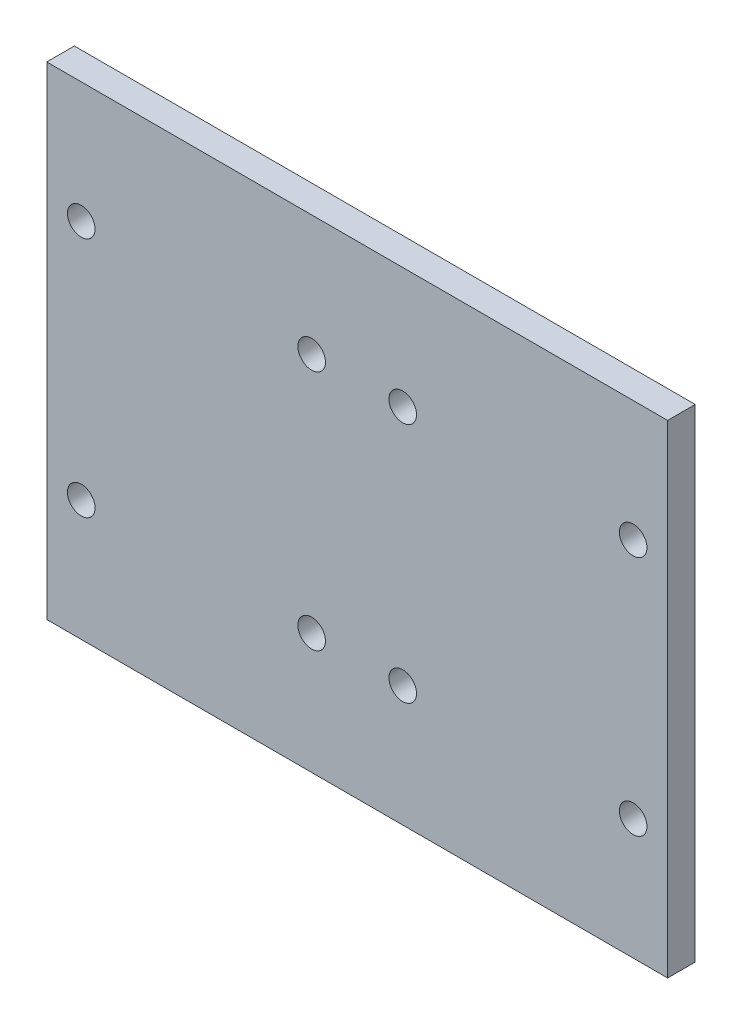
ISO-10303-21;
HEADER;
FILE_DESCRIPTION(('STEP AP214'),'2;1');
FILE_NAME('part.step','',(''),(''),'','','');
FILE_SCHEMA(('AUTOMOTIVE_DESIGN { 1 0 10303 214 1 1 1 1 }'));
ENDSEC;
DATA;
#1=APPLICATION_CONTEXT('core data for automotive mechanical design processes');
#2=APPLICATION_PROTOCOL_DEFINITION('international standard','automotive_design',2000,#1);
#3=PRODUCT_CONTEXT('',#1,'mechanical');
#4=PRODUCT('Part','Part','',(#3));
#5=PRODUCT_RELATED_PRODUCT_CATEGORY('part','',(#4));
#6=PRODUCT_DEFINITION_FORMATION('','',#4);
#7=PRODUCT_DEFINITION_CONTEXT('part definition',#1,'design');
#8=PRODUCT_DEFINITION('design','',#6,#7);
#9=PRODUCT_DEFINITION_SHAPE('','',#8);
#10=(LENGTH_UNIT() NAMED_UNIT(*) SI_UNIT(.MILLI.,.METRE.));
#11=(NAMED_UNIT(*) PLANE_ANGLE_UNIT() SI_UNIT($,.RADIAN.));
#12=(NAMED_UNIT(*) SI_UNIT($,.STERADIAN.) SOLID_ANGLE_UNIT());
#13=UNCERTAINTY_MEASURE_WITH_UNIT(LENGTH_MEASURE(1.E-05),#10,'distance_accuracy_value','');
#14=(GEOMETRIC_REPRESENTATION_CONTEXT(3) GLOBAL_UNCERTAINTY_ASSIGNED_CONTEXT((#13)) GLOBAL_UNIT_ASSIGNED_CONTEXT((#10,
#11,#12)) REPRESENTATION_CONTEXT('',''));
#15=CARTESIAN_POINT('',(0.,0.,0.));
#16=DIRECTION('',(0.,0.,1.));
#17=DIRECTION('',(1.,0.,0.));
#18=AXIS2_PLACEMENT_3D('',#15,#16,#17);
#19=CARTESIAN_POINT('',(0.,0.,4.));
#20=DIRECTION('',(0.,0.,1.));
#21=DIRECTION('',(1.,0.,0.));
#22=AXIS2_PLACEMENT_3D('',#19,#20,#21);
#23=PLANE('',#22);
#24=CARTESIAN_POINT('',(-40.,-17.5,4.));
#25=DIRECTION('',(0.,0.,1.));
#26=DIRECTION('',(1.,0.,0.));
#27=AXIS2_PLACEMENT_3D('',#24,#25,#26);
#28=CIRCLE('',#27,2.);
#29=CARTESIAN_POINT('',(-38.,-17.5,4.));
#30=VERTEX_POINT('',#29);
#31=EDGE_CURVE('E145',#30,#30,#28,.T.);
#32=ORIENTED_EDGE('',*,*,#31,.F.);
#33=EDGE_LOOP('',(#32));
#34=FACE_BOUND('',#33,.T.);
#35=CARTESIAN_POINT('',(-6.6,-17.5,4.));
#36=DIRECTION('',(0.,0.,1.));
#37=DIRECTION('',(1.,0.,0.));
#38=AXIS2_PLACEMENT_3D('',#35,#36,#37);
#39=CIRCLE('',#38,2.);
#40=CARTESIAN_POINT('',(-4.6,-17.5,4.));
#41=VERTEX_POINT('',#40);
#42=EDGE_CURVE('E133',#41,#41,#39,.T.);
#43=ORIENTED_EDGE('',*,*,#42,.F.);
#44=EDGE_LOOP('',(#43));
#45=FACE_BOUND('',#44,.T.);
#46=CARTESIAN_POINT('',(-6.6,17.5,4.));
#47=DIRECTION('',(0.,0.,1.));
#48=DIRECTION('',(1.,0.,0.));
#49=AXIS2_PLACEMENT_3D('',#46,#47,#48);
#50=CIRCLE('',#49,2.);
#51=CARTESIAN_POINT('',(-4.6,17.5,4.));
#52=VERTEX_POINT('',#51);
#53=EDGE_CURVE('E121',#52,#52,#50,.T.);
#54=ORIENTED_EDGE('',*,*,#53,.F.);
#55=EDGE_LOOP('',(#54));
#56=FACE_BOUND('',#55,.T.);
#57=CARTESIAN_POINT('',(6.6,-17.5,4.));
#58=DIRECTION('',(0.,0.,1.));
#59=DIRECTION('',(1.,0.,0.));
#60=AXIS2_PLACEMENT_3D('',#57,#58,#59);
#61=CIRCLE('',#60,2.);
#62=CARTESIAN_POINT('',(8.6,-17.5,4.));
#63=VERTEX_POINT('',#62);
#64=EDGE_CURVE('E100',#63,#63,#61,.T.);
#65=ORIENTED_EDGE('',*,*,#64,.F.);
#66=EDGE_LOOP('',(#65));
#67=FACE_BOUND('',#66,.T.);
#68=DIRECTION('',(0.,1.,0.));
#69=VECTOR('',#68,1.);
#70=CARTESIAN_POINT('',(45.,-35.,4.));
#71=LINE('',#70,#69);
#72=CARTESIAN_POINT('',(45.,-35.,4.));
#73=VERTEX_POINT('',#72);
#74=CARTESIAN_POINT('',(45.,35.,4.));
#75=VERTEX_POINT('',#74);
#76=EDGE_CURVE('E85',#73,#75,#71,.T.);
#77=ORIENTED_EDGE('',*,*,#76,.T.);
#78=DIRECTION('',(-1.,0.,0.));
#79=VECTOR('',#78,1.);
#80=CARTESIAN_POINT('',(45.,35.,4.));
#81=LINE('',#80,#79);
#82=CARTESIAN_POINT('',(-45.,35.,4.));
#83=VERTEX_POINT('',#82);
#84=EDGE_CURVE('E80',#75,#83,#81,.T.);
#85=ORIENTED_EDGE('',*,*,#84,.T.);
#86=DIRECTION('',(0.,-1.,0.));
#87=VECTOR('',#86,1.);
#88=CARTESIAN_POINT('',(-45.,35.,4.));
#89=LINE('',#88,#87);
#90=CARTESIAN_POINT('',(-45.,-35.,4.));
#91=VERTEX_POINT('',#90);
#92=EDGE_CURVE('E83',#83,#91,#89,.T.);
#93=ORIENTED_EDGE('',*,*,#92,.T.);
#94=DIRECTION('',(1.,0.,0.));
#95=VECTOR('',#94,1.);
#96=CARTESIAN_POINT('',(-45.,-35.,4.));
#97=LINE('',#96,#95);
#98=EDGE_CURVE('E50',#91,#73,#97,.T.);
#99=ORIENTED_EDGE('',*,*,#98,.T.);
#100=EDGE_LOOP('',(#77,#85,#93,#99));
#101=FACE_BOUND('',#100,.T.);
#102=CARTESIAN_POINT('',(40.,-17.5,4.));
#103=DIRECTION('',(0.,0.,1.));
#104=DIRECTION('',(1.,0.,0.));
#105=AXIS2_PLACEMENT_3D('',#102,#103,#104);
#106=CIRCLE('',#105,2.);
#107=CARTESIAN_POINT('',(42.,-17.5,4.));
#108=VERTEX_POINT('',#107);
#109=EDGE_CURVE('E115',#108,#108,#106,.T.);
#110=ORIENTED_EDGE('',*,*,#109,.F.);
#111=EDGE_LOOP('',(#110));
#112=FACE_BOUND('',#111,.T.);
#113=CARTESIAN_POINT('',(6.6,17.5,4.));
#114=DIRECTION('',(0.,0.,1.));
#115=DIRECTION('',(1.,0.,0.));
#116=AXIS2_PLACEMENT_3D('',#113,#114,#115);
#117=CIRCLE('',#116,2.);
#118=CARTESIAN_POINT('',(8.6,17.5,4.));
#119=VERTEX_POINT('',#118);
#120=EDGE_CURVE('E127',#119,#119,#117,.T.);
#121=ORIENTED_EDGE('',*,*,#120,.F.);
#122=EDGE_LOOP('',(#121));
#123=FACE_BOUND('',#122,.T.);
#124=CARTESIAN_POINT('',(-40.,17.5,4.));
#125=DIRECTION('',(0.,0.,1.));
#126=DIRECTION('',(1.,0.,0.));
#127=AXIS2_PLACEMENT_3D('',#124,#125,#126);
#128=CIRCLE('',#127,2.);
#129=CARTESIAN_POINT('',(-38.,17.5,4.));
#130=VERTEX_POINT('',#129);
#131=EDGE_CURVE('E139',#130,#130,#128,.T.);
#132=ORIENTED_EDGE('',*,*,#131,.F.);
#133=EDGE_LOOP('',(#132));
#134=FACE_BOUND('',#133,.T.);
#135=CARTESIAN_POINT('',(40.,17.5,4.));
#136=DIRECTION('',(0.,0.,1.));
#137=DIRECTION('',(1.,0.,0.));
#138=AXIS2_PLACEMENT_3D('',#135,#136,#137);
#139=CIRCLE('',#138,2.);
#140=CARTESIAN_POINT('',(42.,17.5,4.));
#141=VERTEX_POINT('',#140);
#142=EDGE_CURVE('E151',#141,#141,#139,.T.);
#143=ORIENTED_EDGE('',*,*,#142,.F.);
#144=EDGE_LOOP('',(#143));
#145=FACE_BOUND('',#144,.T.);
#146=ADVANCED_FACE('F33',(#34,#45,#56,#67,#101,#112,#123,#134,#145),#23,.T.);
#147=CARTESIAN_POINT('',(0.,0.,0.));
#148=DIRECTION('',(0.,0.,1.));
#149=DIRECTION('',(1.,0.,0.));
#150=AXIS2_PLACEMENT_3D('',#147,#148,#149);
#151=PLANE('',#150);
#152=DIRECTION('',(0.,1.,0.));
#153=VECTOR('',#152,1.);
#154=CARTESIAN_POINT('',(45.,-35.,0.));
#155=LINE('',#154,#153);
#156=CARTESIAN_POINT('',(45.,-35.,0.));
#157=VERTEX_POINT('',#156);
#158=CARTESIAN_POINT('',(45.,35.,0.));
#159=VERTEX_POINT('',#158);
#160=EDGE_CURVE('E97',#157,#159,#155,.T.);
#161=ORIENTED_EDGE('',*,*,#160,.F.);
#162=DIRECTION('',(1.,0.,0.));
#163=VECTOR('',#162,1.);
#164=CARTESIAN_POINT('',(-45.,-35.,0.));
#165=LINE('',#164,#163);
#166=CARTESIAN_POINT('',(-45.,-35.,0.));
#167=VERTEX_POINT('',#166);
#168=EDGE_CURVE('E73',#167,#157,#165,.T.);
#169=ORIENTED_EDGE('',*,*,#168,.F.);
#170=DIRECTION('',(0.,-1.,0.));
#171=VECTOR('',#170,1.);
#172=CARTESIAN_POINT('',(-45.,35.,0.));
#173=LINE('',#172,#171);
#174=CARTESIAN_POINT('',(-45.,35.,0.));
#175=VERTEX_POINT('',#174);
#176=EDGE_CURVE('E67',#175,#167,#173,.T.);
#177=ORIENTED_EDGE('',*,*,#176,.F.);
#178=DIRECTION('',(-1.,0.,0.));
#179=VECTOR('',#178,1.);
#180=CARTESIAN_POINT('',(45.,35.,0.));
#181=LINE('',#180,#179);
#182=EDGE_CURVE('E89',#159,#175,#181,.T.);
#183=ORIENTED_EDGE('',*,*,#182,.F.);
#184=EDGE_LOOP('',(#161,#169,#177,#183));
#185=FACE_BOUND('',#184,.T.);
#186=CARTESIAN_POINT('',(6.6,-17.5,0.));
#187=DIRECTION('',(0.,0.,1.));
#188=DIRECTION('',(1.,0.,0.));
#189=AXIS2_PLACEMENT_3D('',#186,#187,#188);
#190=CIRCLE('',#189,2.);
#191=CARTESIAN_POINT('',(8.6,-17.5,0.));
#192=VERTEX_POINT('',#191);
#193=EDGE_CURVE('E112',#192,#192,#190,.T.);
#194=ORIENTED_EDGE('',*,*,#193,.T.);
#195=EDGE_LOOP('',(#194));
#196=FACE_BOUND('',#195,.T.);
#197=CARTESIAN_POINT('',(40.,-17.5,0.));
#198=DIRECTION('',(0.,0.,1.));
#199=DIRECTION('',(1.,0.,0.));
#200=AXIS2_PLACEMENT_3D('',#197,#198,#199);
#201=CIRCLE('',#200,2.);
#202=CARTESIAN_POINT('',(42.,-17.5,0.));
#203=VERTEX_POINT('',#202);
#204=EDGE_CURVE('E118',#203,#203,#201,.T.);
#205=ORIENTED_EDGE('',*,*,#204,.T.);
#206=EDGE_LOOP('',(#205));
#207=FACE_BOUND('',#206,.T.);
#208=CARTESIAN_POINT('',(-6.6,17.5,0.));
#209=DIRECTION('',(0.,0.,1.));
#210=DIRECTION('',(1.,0.,0.));
#211=AXIS2_PLACEMENT_3D('',#208,#209,#210);
#212=CIRCLE('',#211,2.);
#213=CARTESIAN_POINT('',(-4.6,17.5,0.));
#214=VERTEX_POINT('',#213);
#215=EDGE_CURVE('E124',#214,#214,#212,.T.);
#216=ORIENTED_EDGE('',*,*,#215,.T.);
#217=EDGE_LOOP('',(#216));
#218=FACE_BOUND('',#217,.T.);
#219=CARTESIAN_POINT('',(6.6,17.5,0.));
#220=DIRECTION('',(0.,0.,1.));
#221=DIRECTION('',(1.,0.,0.));
#222=AXIS2_PLACEMENT_3D('',#219,#220,#221);
#223=CIRCLE('',#222,2.);
#224=CARTESIAN_POINT('',(8.6,17.5,0.));
#225=VERTEX_POINT('',#224);
#226=EDGE_CURVE('E130',#225,#225,#223,.T.);
#227=ORIENTED_EDGE('',*,*,#226,.T.);
#228=EDGE_LOOP('',(#227));
#229=FACE_BOUND('',#228,.T.);
#230=CARTESIAN_POINT('',(-6.6,-17.5,0.));
#231=DIRECTION('',(0.,0.,1.));
#232=DIRECTION('',(1.,0.,0.));
#233=AXIS2_PLACEMENT_3D('',#230,#231,#232);
#234=CIRCLE('',#233,2.);
#235=CARTESIAN_POINT('',(-4.6,-17.5,0.));
#236=VERTEX_POINT('',#235);
#237=EDGE_CURVE('E136',#236,#236,#234,.T.);
#238=ORIENTED_EDGE('',*,*,#237,.T.);
#239=EDGE_LOOP('',(#238));
#240=FACE_BOUND('',#239,.T.);
#241=CARTESIAN_POINT('',(-40.,17.5,0.));
#242=DIRECTION('',(0.,0.,1.));
#243=DIRECTION('',(1.,0.,0.));
#244=AXIS2_PLACEMENT_3D('',#241,#242,#243);
#245=CIRCLE('',#244,2.);
#246=CARTESIAN_POINT('',(-38.,17.5,0.));
#247=VERTEX_POINT('',#246);
#248=EDGE_CURVE('E142',#247,#247,#245,.T.);
#249=ORIENTED_EDGE('',*,*,#248,.T.);
#250=EDGE_LOOP('',(#249));
#251=FACE_BOUND('',#250,.T.);
#252=CARTESIAN_POINT('',(-40.,-17.5,0.));
#253=DIRECTION('',(0.,0.,1.));
#254=DIRECTION('',(1.,0.,0.));
#255=AXIS2_PLACEMENT_3D('',#252,#253,#254);
#256=CIRCLE('',#255,2.);
#257=CARTESIAN_POINT('',(-38.,-17.5,0.));
#258=VERTEX_POINT('',#257);
#259=EDGE_CURVE('E148',#258,#258,#256,.T.);
#260=ORIENTED_EDGE('',*,*,#259,.T.);
#261=EDGE_LOOP('',(#260));
#262=FACE_BOUND('',#261,.T.);
#263=CARTESIAN_POINT('',(40.,17.5,0.));
#264=DIRECTION('',(0.,0.,1.));
#265=DIRECTION('',(1.,0.,0.));
#266=AXIS2_PLACEMENT_3D('',#263,#264,#265);
#267=CIRCLE('',#266,2.);
#268=CARTESIAN_POINT('',(42.,17.5,0.));
#269=VERTEX_POINT('',#268);
#270=EDGE_CURVE('E154',#269,#269,#267,.T.);
#271=ORIENTED_EDGE('',*,*,#270,.T.);
#272=EDGE_LOOP('',(#271));
#273=FACE_BOUND('',#272,.T.);
#274=ADVANCED_FACE('F108',(#185,#196,#207,#218,#229,#240,#251,#262,#273),#151,.F.);
#275=CARTESIAN_POINT('',(45.,-35.,4.));
#276=DIRECTION('',(-1.,0.,0.));
#277=DIRECTION('',(0.,0.,1.));
#278=AXIS2_PLACEMENT_3D('',#275,#276,#277);
#279=PLANE('',#278);
#280=ORIENTED_EDGE('',*,*,#160,.T.);
#281=DIRECTION('',(0.,0.,-1.));
#282=VECTOR('',#281,1.);
#283=CARTESIAN_POINT('',(45.,35.,4.));
#284=LINE('',#283,#282);
#285=EDGE_CURVE('E11',#75,#159,#284,.T.);
#286=ORIENTED_EDGE('',*,*,#285,.F.);
#287=ORIENTED_EDGE('',*,*,#76,.F.);
#288=DIRECTION('',(0.,0.,-1.));
#289=VECTOR('',#288,1.);
#290=CARTESIAN_POINT('',(45.,-35.,4.));
#291=LINE('',#290,#289);
#292=EDGE_CURVE('E93',#73,#157,#291,.T.);
#293=ORIENTED_EDGE('',*,*,#292,.T.);
#294=EDGE_LOOP('',(#280,#286,#287,#293));
#295=FACE_BOUND('',#294,.T.);
#296=ADVANCED_FACE('F35',(#295),#279,.F.);
#297=CARTESIAN_POINT('',(45.,35.,4.));
#298=DIRECTION('',(0.,-1.,0.));
#299=DIRECTION('',(1.,0.,0.));
#300=AXIS2_PLACEMENT_3D('',#297,#298,#299);
#301=PLANE('',#300);
#302=ORIENTED_EDGE('',*,*,#182,.T.);
#303=DIRECTION('',(0.,0.,-1.));
#304=VECTOR('',#303,1.);
#305=CARTESIAN_POINT('',(-45.,35.,4.));
#306=LINE('',#305,#304);
#307=EDGE_CURVE('E42',#83,#175,#306,.T.);
#308=ORIENTED_EDGE('',*,*,#307,.F.);
#309=ORIENTED_EDGE('',*,*,#84,.F.);
#310=ORIENTED_EDGE('',*,*,#285,.T.);
#311=EDGE_LOOP('',(#302,#308,#309,#310));
#312=FACE_BOUND('',#311,.T.);
#313=ADVANCED_FACE('F88',(#312),#301,.F.);
#314=CARTESIAN_POINT('',(-45.,35.,4.));
#315=DIRECTION('',(1.,0.,0.));
#316=DIRECTION('',(0.,1.,0.));
#317=AXIS2_PLACEMENT_3D('',#314,#315,#316);
#318=PLANE('',#317);
#319=ORIENTED_EDGE('',*,*,#176,.T.);
#320=DIRECTION('',(0.,0.,-1.));
#321=VECTOR('',#320,1.);
#322=CARTESIAN_POINT('',(-45.,-35.,4.));
#323=LINE('',#322,#321);
#324=EDGE_CURVE('E90',#91,#167,#323,.T.);
#325=ORIENTED_EDGE('',*,*,#324,.F.);
#326=ORIENTED_EDGE('',*,*,#92,.F.);
#327=ORIENTED_EDGE('',*,*,#307,.T.);
#328=EDGE_LOOP('',(#319,#325,#326,#327));
#329=FACE_BOUND('',#328,.T.);
#330=ADVANCED_FACE('F91',(#329),#318,.F.);
#331=CARTESIAN_POINT('',(-45.,-35.,4.));
#332=DIRECTION('',(0.,1.,0.));
#333=DIRECTION('',(-1.,0.,0.));
#334=AXIS2_PLACEMENT_3D('',#331,#332,#333);
#335=PLANE('',#334);
#336=ORIENTED_EDGE('',*,*,#168,.T.);
#337=ORIENTED_EDGE('',*,*,#292,.F.);
#338=ORIENTED_EDGE('',*,*,#98,.F.);
#339=ORIENTED_EDGE('',*,*,#324,.T.);
#340=EDGE_LOOP('',(#336,#337,#338,#339));
#341=FACE_BOUND('',#340,.T.);
#342=ADVANCED_FACE('F105',(#341),#335,.F.);
#343=CARTESIAN_POINT('',(6.6,-17.5,4.));
#344=DIRECTION('',(0.,0.,-1.));
#345=DIRECTION('',(-1.,0.,0.));
#346=AXIS2_PLACEMENT_3D('',#343,#344,#345);
#347=CYLINDRICAL_SURFACE('',#346,2.);
#348=ORIENTED_EDGE('',*,*,#64,.T.);
#349=EDGE_LOOP('',(#348));
#350=FACE_BOUND('',#349,.T.);
#351=ORIENTED_EDGE('',*,*,#193,.F.);
#352=EDGE_LOOP('',(#351));
#353=FACE_BOUND('',#352,.T.);
#354=ADVANCED_FACE('F173',(#350,#353),#347,.F.);
#355=CARTESIAN_POINT('',(40.,-17.5,4.));
#356=DIRECTION('',(0.,0.,-1.));
#357=DIRECTION('',(-1.,0.,0.));
#358=AXIS2_PLACEMENT_3D('',#355,#356,#357);
#359=CYLINDRICAL_SURFACE('',#358,2.);
#360=ORIENTED_EDGE('',*,*,#109,.T.);
#361=EDGE_LOOP('',(#360));
#362=FACE_BOUND('',#361,.T.);
#363=ORIENTED_EDGE('',*,*,#204,.F.);
#364=EDGE_LOOP('',(#363));
#365=FACE_BOUND('',#364,.T.);
#366=ADVANCED_FACE('F219',(#362,#365),#359,.F.);
#367=CARTESIAN_POINT('',(-6.6,17.5,4.));
#368=DIRECTION('',(0.,0.,-1.));
#369=DIRECTION('',(-1.,0.,0.));
#370=AXIS2_PLACEMENT_3D('',#367,#368,#369);
#371=CYLINDRICAL_SURFACE('',#370,2.);
#372=ORIENTED_EDGE('',*,*,#53,.T.);
#373=EDGE_LOOP('',(#372));
#374=FACE_BOUND('',#373,.T.);
#375=ORIENTED_EDGE('',*,*,#215,.F.);
#376=EDGE_LOOP('',(#375));
#377=FACE_BOUND('',#376,.T.);
#378=ADVANCED_FACE('F227',(#374,#377),#371,.F.);
#379=CARTESIAN_POINT('',(6.6,17.5,4.));
#380=DIRECTION('',(0.,0.,-1.));
#381=DIRECTION('',(-1.,0.,0.));
#382=AXIS2_PLACEMENT_3D('',#379,#380,#381);
#383=CYLINDRICAL_SURFACE('',#382,2.);
#384=ORIENTED_EDGE('',*,*,#120,.T.);
#385=EDGE_LOOP('',(#384));
#386=FACE_BOUND('',#385,.T.);
#387=ORIENTED_EDGE('',*,*,#226,.F.);
#388=EDGE_LOOP('',(#387));
#389=FACE_BOUND('',#388,.T.);
#390=ADVANCED_FACE('F235',(#386,#389),#383,.F.);
#391=CARTESIAN_POINT('',(-6.6,-17.5,4.));
#392=DIRECTION('',(0.,0.,-1.));
#393=DIRECTION('',(-1.,0.,0.));
#394=AXIS2_PLACEMENT_3D('',#391,#392,#393);
#395=CYLINDRICAL_SURFACE('',#394,2.);
#396=ORIENTED_EDGE('',*,*,#42,.T.);
#397=EDGE_LOOP('',(#396));
#398=FACE_BOUND('',#397,.T.);
#399=ORIENTED_EDGE('',*,*,#237,.F.);
#400=EDGE_LOOP('',(#399));
#401=FACE_BOUND('',#400,.T.);
#402=ADVANCED_FACE('F244',(#398,#401),#395,.F.);
#403=CARTESIAN_POINT('',(-40.,17.5,4.));
#404=DIRECTION('',(0.,0.,-1.));
#405=DIRECTION('',(-1.,0.,0.));
#406=AXIS2_PLACEMENT_3D('',#403,#404,#405);
#407=CYLINDRICAL_SURFACE('',#406,2.);
#408=ORIENTED_EDGE('',*,*,#131,.T.);
#409=EDGE_LOOP('',(#408));
#410=FACE_BOUND('',#409,.T.);
#411=ORIENTED_EDGE('',*,*,#248,.F.);
#412=EDGE_LOOP('',(#411));
#413=FACE_BOUND('',#412,.T.);
#414=ADVANCED_FACE('F253',(#410,#413),#407,.F.);
#415=CARTESIAN_POINT('',(-40.,-17.5,4.));
#416=DIRECTION('',(0.,0.,-1.));
#417=DIRECTION('',(-1.,0.,0.));
#418=AXIS2_PLACEMENT_3D('',#415,#416,#417);
#419=CYLINDRICAL_SURFACE('',#418,2.);
#420=ORIENTED_EDGE('',*,*,#31,.T.);
#421=EDGE_LOOP('',(#420));
#422=FACE_BOUND('',#421,.T.);
#423=ORIENTED_EDGE('',*,*,#259,.F.);
#424=EDGE_LOOP('',(#423));
#425=FACE_BOUND('',#424,.T.);
#426=ADVANCED_FACE('F262',(#422,#425),#419,.F.);
#427=CARTESIAN_POINT('',(40.,17.5,4.));
#428=DIRECTION('',(0.,0.,-1.));
#429=DIRECTION('',(-1.,0.,0.));
#430=AXIS2_PLACEMENT_3D('',#427,#428,#429);
#431=CYLINDRICAL_SURFACE('',#430,2.);
#432=ORIENTED_EDGE('',*,*,#142,.T.);
#433=EDGE_LOOP('',(#432));
#434=FACE_BOUND('',#433,.T.);
#435=ORIENTED_EDGE('',*,*,#270,.F.);
#436=EDGE_LOOP('',(#435));
#437=FACE_BOUND('',#436,.T.);
#438=ADVANCED_FACE('F160',(#434,#437),#431,.F.);
#439=CLOSED_SHELL('',(#146,#274,#296,#313,#330,#342,#354,#366,#378,#390,#402,#414,#426,#438));
#440=MANIFOLD_SOLID_BREP('B2',#439);
#441=ADVANCED_BREP_SHAPE_REPRESENTATION('',(#18,#440),#14);
#442=SHAPE_DEFINITION_REPRESENTATION(#9,#441);
ENDSEC;
END-ISO-10303-21;
